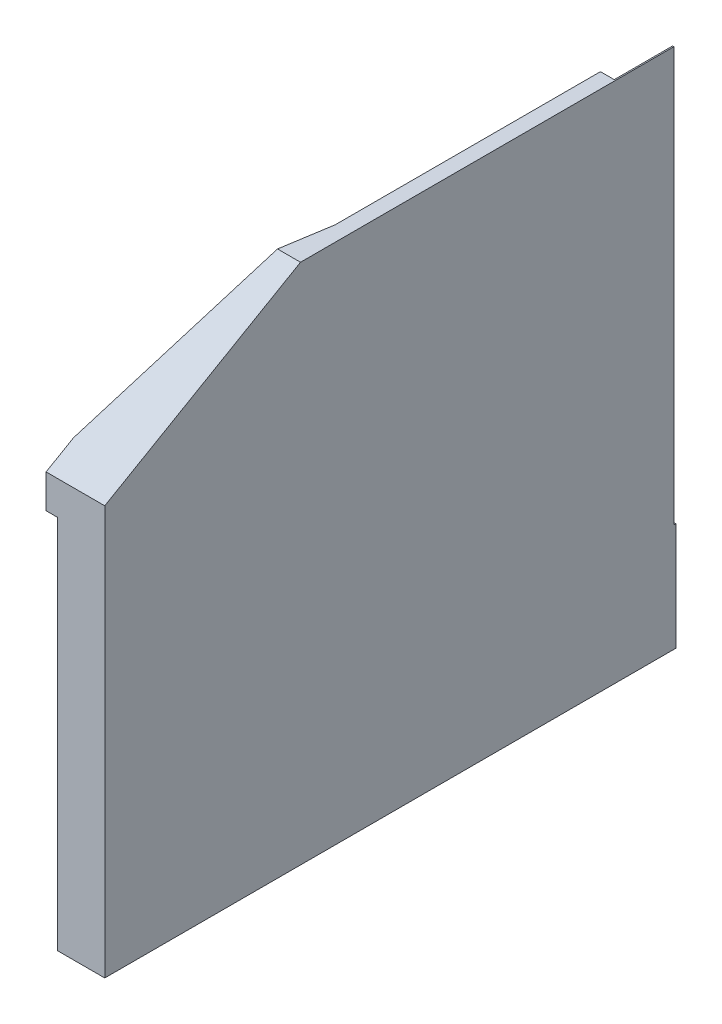
ISO-10303-21;
HEADER;
FILE_DESCRIPTION(('STEP AP214'),'2;1');
FILE_NAME('part.step','',(''),(''),'','','');
FILE_SCHEMA(('AUTOMOTIVE_DESIGN { 1 0 10303 214 1 1 1 1 }'));
ENDSEC;
DATA;
#1=APPLICATION_CONTEXT('core data for automotive mechanical design processes');
#2=APPLICATION_PROTOCOL_DEFINITION('international standard','automotive_design',2000,#1);
#3=PRODUCT_CONTEXT('',#1,'mechanical');
#4=PRODUCT('Part','Part','',(#3));
#5=PRODUCT_RELATED_PRODUCT_CATEGORY('part','',(#4));
#6=PRODUCT_DEFINITION_FORMATION('','',#4);
#7=PRODUCT_DEFINITION_CONTEXT('part definition',#1,'design');
#8=PRODUCT_DEFINITION('design','',#6,#7);
#9=PRODUCT_DEFINITION_SHAPE('','',#8);
#10=(LENGTH_UNIT() NAMED_UNIT(*) SI_UNIT(.MILLI.,.METRE.));
#11=(NAMED_UNIT(*) PLANE_ANGLE_UNIT() SI_UNIT($,.RADIAN.));
#12=(NAMED_UNIT(*) SI_UNIT($,.STERADIAN.) SOLID_ANGLE_UNIT());
#13=UNCERTAINTY_MEASURE_WITH_UNIT(LENGTH_MEASURE(1.E-05),#10,'distance_accuracy_value','');
#14=(GEOMETRIC_REPRESENTATION_CONTEXT(3) GLOBAL_UNCERTAINTY_ASSIGNED_CONTEXT((#13)) GLOBAL_UNIT_ASSIGNED_CONTEXT((#10,
#11,#12)) REPRESENTATION_CONTEXT('',''));
#15=CARTESIAN_POINT('',(0.,0.,0.));
#16=DIRECTION('',(0.,0.,1.));
#17=DIRECTION('',(1.,0.,0.));
#18=AXIS2_PLACEMENT_3D('',#15,#16,#17);
#19=CARTESIAN_POINT('',(145.5,-389.,1434.5));
#20=DIRECTION('',(1.,0.,0.));
#21=DIRECTION('',(0.,0.,1.));
#22=AXIS2_PLACEMENT_3D('',#19,#20,#21);
#23=PLANE('',#22);
#24=DIRECTION('',(0.,0.,1.));
#25=VECTOR('',#24,1.);
#26=CARTESIAN_POINT('',(145.5,216.,1437.));
#27=LINE('',#26,#25);
#28=CARTESIAN_POINT('',(145.5,216.,1437.));
#29=VERTEX_POINT('',#28);
#30=CARTESIAN_POINT('',(145.5,216.,1869.6013442085));
#31=VERTEX_POINT('',#30);
#32=EDGE_CURVE('E11',#29,#31,#27,.T.);
#33=ORIENTED_EDGE('',*,*,#32,.T.);
#34=DIRECTION('',(0.,0.500000000000017,-0.866025403784429));
#35=VECTOR('',#34,1.);
#36=CARTESIAN_POINT('',(145.5,85.,2096.5));
#37=LINE('',#36,#35);
#38=CARTESIAN_POINT('',(145.5,85.,2096.5));
#39=VERTEX_POINT('',#38);
#40=EDGE_CURVE('E36',#39,#31,#37,.T.);
#41=ORIENTED_EDGE('',*,*,#40,.F.);
#42=DIRECTION('',(0.,-1.,0.));
#43=VECTOR('',#42,1.);
#44=CARTESIAN_POINT('',(145.5,85.,2096.5));
#45=LINE('',#44,#43);
#46=CARTESIAN_POINT('',(145.5,-389.,2096.5));
#47=VERTEX_POINT('',#46);
#48=EDGE_CURVE('E27',#39,#47,#45,.T.);
#49=ORIENTED_EDGE('',*,*,#48,.T.);
#50=DIRECTION('',(0.,0.,-1.));
#51=VECTOR('',#50,1.);
#52=CARTESIAN_POINT('',(145.5,-389.,2096.5));
#53=LINE('',#52,#51);
#54=CARTESIAN_POINT('',(145.5,-389.,1434.5));
#55=VERTEX_POINT('',#54);
#56=EDGE_CURVE('E269',#47,#55,#53,.T.);
#57=ORIENTED_EDGE('',*,*,#56,.T.);
#58=DIRECTION('',(0.,1.,0.));
#59=VECTOR('',#58,1.);
#60=CARTESIAN_POINT('',(145.5,-389.,1434.5));
#61=LINE('',#60,#59);
#62=CARTESIAN_POINT('',(145.5,-264.,1434.5));
#63=VERTEX_POINT('',#62);
#64=EDGE_CURVE('E212',#55,#63,#61,.T.);
#65=ORIENTED_EDGE('',*,*,#64,.T.);
#66=DIRECTION('',(0.,0.,1.));
#67=VECTOR('',#66,1.);
#68=CARTESIAN_POINT('',(145.5,-264.,1434.5));
#69=LINE('',#68,#67);
#70=CARTESIAN_POINT('',(145.5,-264.,1437.));
#71=VERTEX_POINT('',#70);
#72=EDGE_CURVE('E209',#63,#71,#69,.T.);
#73=ORIENTED_EDGE('',*,*,#72,.T.);
#74=DIRECTION('',(0.,-1.,0.));
#75=VECTOR('',#74,1.);
#76=CARTESIAN_POINT('',(145.5,216.,1437.));
#77=LINE('',#76,#75);
#78=EDGE_CURVE('E250',#29,#71,#77,.T.);
#79=ORIENTED_EDGE('',*,*,#78,.F.);
#80=EDGE_LOOP('',(#33,#41,#49,#57,#65,#73,#79));
#81=FACE_BOUND('',#80,.T.);
#82=ADVANCED_FACE('F17',(#81),#23,.T.);
#83=CARTESIAN_POINT('',(145.5,-389.,1437.));
#84=DIRECTION('',(0.,0.,1.));
#85=DIRECTION('',(1.,0.,0.));
#86=AXIS2_PLACEMENT_3D('',#83,#84,#85);
#87=PLANE('',#86);
#88=DIRECTION('',(1.,0.,0.));
#89=VECTOR('',#88,1.);
#90=CARTESIAN_POINT('',(144.,216.,1437.));
#91=LINE('',#90,#89);
#92=CARTESIAN_POINT('',(144.,216.,1437.));
#93=VERTEX_POINT('',#92);
#94=EDGE_CURVE('E213',#93,#29,#91,.T.);
#95=ORIENTED_EDGE('',*,*,#94,.T.);
#96=ORIENTED_EDGE('',*,*,#78,.T.);
#97=DIRECTION('',(1.,0.,0.));
#98=VECTOR('',#97,1.);
#99=CARTESIAN_POINT('',(144.,-264.,1437.));
#100=LINE('',#99,#98);
#101=CARTESIAN_POINT('',(144.,-264.,1437.));
#102=VERTEX_POINT('',#101);
#103=EDGE_CURVE('E224',#102,#71,#100,.T.);
#104=ORIENTED_EDGE('',*,*,#103,.F.);
#105=DIRECTION('',(0.,1.,0.));
#106=VECTOR('',#105,1.);
#107=CARTESIAN_POINT('',(144.,-264.,1437.));
#108=LINE('',#107,#106);
#109=EDGE_CURVE('E253',#102,#93,#108,.T.);
#110=ORIENTED_EDGE('',*,*,#109,.T.);
#111=EDGE_LOOP('',(#95,#96,#104,#110));
#112=FACE_BOUND('',#111,.T.);
#113=ADVANCED_FACE('F424',(#112),#87,.F.);
#114=CARTESIAN_POINT('',(144.,216.,1504.5));
#115=DIRECTION('',(1.,0.,0.));
#116=DIRECTION('',(0.,0.,1.));
#117=AXIS2_PLACEMENT_3D('',#114,#115,#116);
#118=PLANE('',#117);
#119=DIRECTION('',(0.,0.,1.));
#120=VECTOR('',#119,1.);
#121=CARTESIAN_POINT('',(144.,216.,1437.));
#122=LINE('',#121,#120);
#123=CARTESIAN_POINT('',(144.,216.,1504.5));
#124=VERTEX_POINT('',#123);
#125=EDGE_CURVE('E208',#93,#124,#122,.T.);
#126=ORIENTED_EDGE('',*,*,#125,.F.);
#127=ORIENTED_EDGE('',*,*,#109,.F.);
#128=DIRECTION('',(0.,0.,-1.));
#129=VECTOR('',#128,1.);
#130=CARTESIAN_POINT('',(144.,-264.,1437.));
#131=LINE('',#130,#129);
#132=CARTESIAN_POINT('',(144.,-264.,1436.));
#133=VERTEX_POINT('',#132);
#134=EDGE_CURVE('E218',#102,#133,#131,.T.);
#135=ORIENTED_EDGE('',*,*,#134,.T.);
#136=DIRECTION('',(0.,1.,0.));
#137=VECTOR('',#136,1.);
#138=CARTESIAN_POINT('',(144.,-387.5,1436.));
#139=LINE('',#138,#137);
#140=CARTESIAN_POINT('',(144.,-387.5,1436.));
#141=VERTEX_POINT('',#140);
#142=EDGE_CURVE('E163',#141,#133,#139,.T.);
#143=ORIENTED_EDGE('',*,*,#142,.F.);
#144=DIRECTION('',(0.,0.,-1.));
#145=VECTOR('',#144,1.);
#146=CARTESIAN_POINT('',(144.,-387.5,2095.));
#147=LINE('',#146,#145);
#148=CARTESIAN_POINT('',(144.,-387.5,2095.));
#149=VERTEX_POINT('',#148);
#150=EDGE_CURVE('E154',#149,#141,#147,.T.);
#151=ORIENTED_EDGE('',*,*,#150,.F.);
#152=DIRECTION('',(0.,-1.,0.));
#153=VECTOR('',#152,1.);
#154=CARTESIAN_POINT('',(144.,84.1339745962001,2095.));
#155=LINE('',#154,#153);
#156=CARTESIAN_POINT('',(144.,84.1339745962001,2095.));
#157=VERTEX_POINT('',#156);
#158=EDGE_CURVE('E159',#157,#149,#155,.T.);
#159=ORIENTED_EDGE('',*,*,#158,.F.);
#160=DIRECTION('',(0.,0.500000000000017,-0.866025403784429));
#161=VECTOR('',#160,1.);
#162=CARTESIAN_POINT('',(144.,84.1339745962001,2095.));
#163=LINE('',#162,#161);
#164=CARTESIAN_POINT('',(144.,214.5,1869.1994204198));
#165=VERTEX_POINT('',#164);
#166=EDGE_CURVE('E216',#157,#165,#163,.T.);
#167=ORIENTED_EDGE('',*,*,#166,.T.);
#168=DIRECTION('',(0.,0.,1.));
#169=VECTOR('',#168,1.);
#170=CARTESIAN_POINT('',(144.,214.5,1504.5));
#171=LINE('',#170,#169);
#172=CARTESIAN_POINT('',(144.,214.5,1504.5));
#173=VERTEX_POINT('',#172);
#174=EDGE_CURVE('E273',#173,#165,#171,.T.);
#175=ORIENTED_EDGE('',*,*,#174,.F.);
#176=DIRECTION('',(0.,-1.,0.));
#177=VECTOR('',#176,1.);
#178=CARTESIAN_POINT('',(144.,216.,1504.5));
#179=LINE('',#178,#177);
#180=EDGE_CURVE('E231',#124,#173,#179,.T.);
#181=ORIENTED_EDGE('',*,*,#180,.F.);
#182=EDGE_LOOP('',(#126,#127,#135,#143,#151,#159,#167,#175,#181));
#183=FACE_BOUND('',#182,.T.);
#184=ADVANCED_FACE('F157',(#183),#118,.F.);
#185=CARTESIAN_POINT('',(64.,216.,1504.5));
#186=DIRECTION('',(0.,0.,1.));
#187=DIRECTION('',(1.,0.,0.));
#188=AXIS2_PLACEMENT_3D('',#185,#186,#187);
#189=PLANE('',#188);
#190=DIRECTION('',(1.,0.,0.));
#191=VECTOR('',#190,1.);
#192=CARTESIAN_POINT('',(128.,216.,1504.5));
#193=LINE('',#192,#191);
#194=CARTESIAN_POINT('',(128.,216.,1504.5));
#195=VERTEX_POINT('',#194);
#196=EDGE_CURVE('E219',#195,#124,#193,.T.);
#197=ORIENTED_EDGE('',*,*,#196,.T.);
#198=ORIENTED_EDGE('',*,*,#180,.T.);
#199=DIRECTION('',(1.,0.,0.));
#200=VECTOR('',#199,1.);
#201=CARTESIAN_POINT('',(128.,214.5,1504.5));
#202=LINE('',#201,#200);
#203=CARTESIAN_POINT('',(128.,214.5,1504.5));
#204=VERTEX_POINT('',#203);
#205=EDGE_CURVE('E270',#204,#173,#202,.T.);
#206=ORIENTED_EDGE('',*,*,#205,.F.);
#207=DIRECTION('',(0.,1.,0.));
#208=VECTOR('',#207,1.);
#209=CARTESIAN_POINT('',(128.,214.5,1504.5));
#210=LINE('',#209,#208);
#211=EDGE_CURVE('E203',#204,#195,#210,.T.);
#212=ORIENTED_EDGE('',*,*,#211,.T.);
#213=EDGE_LOOP('',(#197,#198,#206,#212));
#214=FACE_BOUND('',#213,.T.);
#215=ADVANCED_FACE('F307',(#214),#189,.F.);
#216=CARTESIAN_POINT('',(128.,240.9814304865,1826.3322373602));
#217=DIRECTION('',(1.,0.,0.));
#218=DIRECTION('',(0.,0.,1.));
#219=AXIS2_PLACEMENT_3D('',#216,#217,#218);
#220=PLANE('',#219);
#221=ORIENTED_EDGE('',*,*,#211,.F.);
#222=DIRECTION('',(0.,0.,1.));
#223=VECTOR('',#222,1.);
#224=CARTESIAN_POINT('',(128.,214.5,1504.5));
#225=LINE('',#224,#223);
#226=CARTESIAN_POINT('',(128.,214.5,1811.0431763403));
#227=VERTEX_POINT('',#226);
#228=EDGE_CURVE('E201',#204,#227,#225,.T.);
#229=ORIENTED_EDGE('',*,*,#228,.T.);
#230=DIRECTION('',(0.,-0.866025403784429,-0.500000000000017));
#231=VECTOR('',#230,1.);
#232=CARTESIAN_POINT('',(128.,216.,1811.9092017441));
#233=LINE('',#232,#231);
#234=CARTESIAN_POINT('',(128.,216.,1811.9092017441));
#235=VERTEX_POINT('',#234);
#236=EDGE_CURVE('E220',#235,#227,#233,.T.);
#237=ORIENTED_EDGE('',*,*,#236,.F.);
#238=DIRECTION('',(0.,0.,1.));
#239=VECTOR('',#238,1.);
#240=CARTESIAN_POINT('',(128.,216.,1504.5));
#241=LINE('',#240,#239);
#242=EDGE_CURVE('E256',#195,#235,#241,.T.);
#243=ORIENTED_EDGE('',*,*,#242,.F.);
#244=EDGE_LOOP('',(#221,#229,#237,#243));
#245=FACE_BOUND('',#244,.T.);
#246=ADVANCED_FACE('F316',(#245),#220,.F.);
#247=CARTESIAN_POINT('',(145.5,216.,1434.5));
#248=DIRECTION('',(0.,1.,0.));
#249=DIRECTION('',(0.,0.,-1.));
#250=AXIS2_PLACEMENT_3D('',#247,#248,#249);
#251=PLANE('',#250);
#252=DIRECTION('',(1.,0.,0.));
#253=VECTOR('',#252,1.);
#254=CARTESIAN_POINT('',(118.83009905763,216.,1869.6013442085));
#255=LINE('',#254,#253);
#256=CARTESIAN_POINT('',(118.83009905763,216.,1869.6013442085));
#257=VERTEX_POINT('',#256);
#258=EDGE_CURVE('E204',#257,#31,#255,.T.);
#259=ORIENTED_EDGE('',*,*,#258,.T.);
#260=ORIENTED_EDGE('',*,*,#32,.F.);
#261=ORIENTED_EDGE('',*,*,#94,.F.);
#262=ORIENTED_EDGE('',*,*,#125,.T.);
#263=ORIENTED_EDGE('',*,*,#196,.F.);
#264=ORIENTED_EDGE('',*,*,#242,.T.);
#265=DIRECTION('',(0.156974894079197,0.,-0.987602593470078));
#266=VECTOR('',#265,1.);
#267=CARTESIAN_POINT('',(118.83009905763,216.,1869.6013442085));
#268=LINE('',#267,#266);
#269=EDGE_CURVE('E222',#257,#235,#268,.T.);
#270=ORIENTED_EDGE('',*,*,#269,.F.);
#271=EDGE_LOOP('',(#259,#260,#261,#262,#263,#264,#270));
#272=FACE_BOUND('',#271,.T.);
#273=ADVANCED_FACE('F320',(#272),#251,.T.);
#274=CARTESIAN_POINT('',(77.5,103.405,2064.6216048867));
#275=DIRECTION('',(0.983571470813392,-0.0902595726252793,0.156334165656399));
#276=DIRECTION('',(0.,0.866025403784386,0.500000000000091));
#277=AXIS2_PLACEMENT_3D('',#274,#275,#276);
#278=PLANE('',#277);
#279=DIRECTION('',(-0.180519145250601,-0.491785735406702,0.851797880162003));
#280=VECTOR('',#279,1.);
#281=CARTESIAN_POINT('',(118.83009905763,216.,1869.6013442085));
#282=LINE('',#281,#280);
#283=CARTESIAN_POINT('',(77.5,103.405,2064.6216048867));
#284=VERTEX_POINT('',#283);
#285=EDGE_CURVE('E215',#257,#284,#282,.T.);
#286=ORIENTED_EDGE('',*,*,#285,.F.);
#287=ORIENTED_EDGE('',*,*,#269,.T.);
#288=ORIENTED_EDGE('',*,*,#236,.T.);
#289=DIRECTION('',(0.156974894079197,0.,-0.987602593470079));
#290=VECTOR('',#289,1.);
#291=CARTESIAN_POINT('',(118.7563322385,214.5,1869.1994204198));
#292=LINE('',#291,#290);
#293=CARTESIAN_POINT('',(118.7563322385,214.5,1869.1994204198));
#294=VERTEX_POINT('',#293);
#295=EDGE_CURVE('E244',#294,#227,#292,.T.);
#296=ORIENTED_EDGE('',*,*,#295,.F.);
#297=DIRECTION('',(-0.180519145250601,-0.491785735406702,0.851797880162003));
#298=VECTOR('',#297,1.);
#299=CARTESIAN_POINT('',(118.7563322385,214.5,1869.1994204198));
#300=LINE('',#299,#298);
#301=CARTESIAN_POINT('',(77.5,102.1059618943,2063.8716048867));
#302=VERTEX_POINT('',#301);
#303=EDGE_CURVE('E223',#294,#302,#300,.T.);
#304=ORIENTED_EDGE('',*,*,#303,.T.);
#305=DIRECTION('',(0.,0.866025403784497,0.499999999999898));
#306=VECTOR('',#305,1.);
#307=CARTESIAN_POINT('',(77.5,102.1059618943,2063.8716048867));
#308=LINE('',#307,#306);
#309=EDGE_CURVE('E264',#302,#284,#308,.T.);
#310=ORIENTED_EDGE('',*,*,#309,.T.);
#311=EDGE_LOOP('',(#286,#287,#288,#296,#304,#310));
#312=FACE_BOUND('',#311,.T.);
#313=ADVANCED_FACE('F397',(#312),#278,.F.);
#314=CARTESIAN_POINT('',(77.5,-389.,1434.5));
#315=DIRECTION('',(1.,0.,0.));
#316=DIRECTION('',(0.,0.,1.));
#317=AXIS2_PLACEMENT_3D('',#314,#315,#316);
#318=PLANE('',#317);
#319=DIRECTION('',(0.,0.500000000000017,-0.866025403784429));
#320=VECTOR('',#319,1.);
#321=CARTESIAN_POINT('',(77.5,84.1339745962001,2095.));
#322=LINE('',#321,#320);
#323=CARTESIAN_POINT('',(77.5,84.1339745962001,2095.));
#324=VERTEX_POINT('',#323);
#325=EDGE_CURVE('E240',#324,#302,#322,.T.);
#326=ORIENTED_EDGE('',*,*,#325,.F.);
#327=DIRECTION('',(0.,1.,0.));
#328=VECTOR('',#327,1.);
#329=CARTESIAN_POINT('',(77.5,46.,2095.));
#330=LINE('',#329,#328);
#331=CARTESIAN_POINT('',(77.5,46.,2095.));
#332=VERTEX_POINT('',#331);
#333=EDGE_CURVE('E266',#332,#324,#330,.T.);
#334=ORIENTED_EDGE('',*,*,#333,.F.);
#335=DIRECTION('',(0.,0.,1.));
#336=VECTOR('',#335,1.);
#337=CARTESIAN_POINT('',(77.5,46.,2095.));
#338=LINE('',#337,#336);
#339=CARTESIAN_POINT('',(77.5,46.,2096.5));
#340=VERTEX_POINT('',#339);
#341=EDGE_CURVE('E287',#332,#340,#338,.T.);
#342=ORIENTED_EDGE('',*,*,#341,.T.);
#343=DIRECTION('',(0.,-1.,0.));
#344=VECTOR('',#343,1.);
#345=CARTESIAN_POINT('',(77.5,85.,2096.5));
#346=LINE('',#345,#344);
#347=CARTESIAN_POINT('',(77.5,85.,2096.5));
#348=VERTEX_POINT('',#347);
#349=EDGE_CURVE('E122',#348,#340,#346,.T.);
#350=ORIENTED_EDGE('',*,*,#349,.F.);
#351=DIRECTION('',(0.,0.500000000000017,-0.866025403784429));
#352=VECTOR('',#351,1.);
#353=CARTESIAN_POINT('',(77.5,85.,2096.5));
#354=LINE('',#353,#352);
#355=EDGE_CURVE('E195',#348,#284,#354,.T.);
#356=ORIENTED_EDGE('',*,*,#355,.T.);
#357=ORIENTED_EDGE('',*,*,#309,.F.);
#358=EDGE_LOOP('',(#326,#334,#342,#350,#356,#357));
#359=FACE_BOUND('',#358,.T.);
#360=ADVANCED_FACE('F389',(#359),#318,.F.);
#361=CARTESIAN_POINT('',(145.5,85.,2096.5));
#362=DIRECTION('',(0.,-0.866025403784429,-0.500000000000017));
#363=DIRECTION('',(-1.,0.,0.));
#364=AXIS2_PLACEMENT_3D('',#361,#362,#363);
#365=PLANE('',#364);
#366=ORIENTED_EDGE('',*,*,#355,.F.);
#367=DIRECTION('',(1.,0.,0.));
#368=VECTOR('',#367,1.);
#369=CARTESIAN_POINT('',(77.5,85.,2096.5));
#370=LINE('',#369,#368);
#371=EDGE_CURVE('E193',#348,#39,#370,.T.);
#372=ORIENTED_EDGE('',*,*,#371,.T.);
#373=ORIENTED_EDGE('',*,*,#40,.T.);
#374=ORIENTED_EDGE('',*,*,#258,.F.);
#375=ORIENTED_EDGE('',*,*,#285,.T.);
#376=EDGE_LOOP('',(#366,#372,#373,#374,#375));
#377=FACE_BOUND('',#376,.T.);
#378=ADVANCED_FACE('F400',(#377),#365,.F.);
#379=CARTESIAN_POINT('',(145.5,216.,2096.5));
#380=DIRECTION('',(0.,0.,1.));
#381=DIRECTION('',(1.,0.,0.));
#382=AXIS2_PLACEMENT_3D('',#379,#380,#381);
#383=PLANE('',#382);
#384=DIRECTION('',(-1.,0.,0.));
#385=VECTOR('',#384,1.);
#386=CARTESIAN_POINT('',(145.5,-389.,2096.5));
#387=LINE('',#386,#385);
#388=CARTESIAN_POINT('',(90.5,-389.,2096.5));
#389=VERTEX_POINT('',#388);
#390=EDGE_CURVE('E236',#47,#389,#387,.T.);
#391=ORIENTED_EDGE('',*,*,#390,.F.);
#392=ORIENTED_EDGE('',*,*,#48,.F.);
#393=ORIENTED_EDGE('',*,*,#371,.F.);
#394=ORIENTED_EDGE('',*,*,#349,.T.);
#395=DIRECTION('',(1.,0.,0.));
#396=VECTOR('',#395,1.);
#397=CARTESIAN_POINT('',(77.5,46.,2096.5));
#398=LINE('',#397,#396);
#399=CARTESIAN_POINT('',(90.5,46.,2096.5));
#400=VERTEX_POINT('',#399);
#401=EDGE_CURVE('E280',#340,#400,#398,.T.);
#402=ORIENTED_EDGE('',*,*,#401,.T.);
#403=DIRECTION('',(0.,1.,0.));
#404=VECTOR('',#403,1.);
#405=CARTESIAN_POINT('',(90.5,-389.,2096.5));
#406=LINE('',#405,#404);
#407=EDGE_CURVE('E248',#389,#400,#406,.T.);
#408=ORIENTED_EDGE('',*,*,#407,.F.);
#409=EDGE_LOOP('',(#391,#392,#393,#394,#402,#408));
#410=FACE_BOUND('',#409,.T.);
#411=ADVANCED_FACE('F381',(#410),#383,.T.);
#412=CARTESIAN_POINT('',(90.5,-389.,1434.5));
#413=DIRECTION('',(1.,0.,0.));
#414=DIRECTION('',(0.,0.,1.));
#415=AXIS2_PLACEMENT_3D('',#412,#413,#414);
#416=PLANE('',#415);
#417=DIRECTION('',(0.,0.,1.));
#418=VECTOR('',#417,1.);
#419=CARTESIAN_POINT('',(90.5,-379.,1436.));
#420=LINE('',#419,#418);
#421=CARTESIAN_POINT('',(90.5,-379.,1436.));
#422=VERTEX_POINT('',#421);
#423=CARTESIAN_POINT('',(90.5,-379.,2095.));
#424=VERTEX_POINT('',#423);
#425=EDGE_CURVE('E187',#422,#424,#420,.T.);
#426=ORIENTED_EDGE('',*,*,#425,.F.);
#427=DIRECTION('',(0.,-1.,0.));
#428=VECTOR('',#427,1.);
#429=CARTESIAN_POINT('',(90.5,-294.,1436.));
#430=LINE('',#429,#428);
#431=CARTESIAN_POINT('',(90.5,-294.,1436.));
#432=VERTEX_POINT('',#431);
#433=EDGE_CURVE('E258',#432,#422,#430,.T.);
#434=ORIENTED_EDGE('',*,*,#433,.F.);
#435=DIRECTION('',(0.,0.,1.));
#436=VECTOR('',#435,1.);
#437=CARTESIAN_POINT('',(90.5,-294.,1434.5));
#438=LINE('',#437,#436);
#439=CARTESIAN_POINT('',(90.5,-294.,1434.5));
#440=VERTEX_POINT('',#439);
#441=EDGE_CURVE('E239',#440,#432,#438,.T.);
#442=ORIENTED_EDGE('',*,*,#441,.F.);
#443=DIRECTION('',(0.,1.,0.));
#444=VECTOR('',#443,1.);
#445=CARTESIAN_POINT('',(90.5,-389.,1434.5));
#446=LINE('',#445,#444);
#447=CARTESIAN_POINT('',(90.5,-389.,1434.5));
#448=VERTEX_POINT('',#447);
#449=EDGE_CURVE('E196',#448,#440,#446,.T.);
#450=ORIENTED_EDGE('',*,*,#449,.F.);
#451=DIRECTION('',(0.,0.,-1.));
#452=VECTOR('',#451,1.);
#453=CARTESIAN_POINT('',(90.5,-389.,2096.5));
#454=LINE('',#453,#452);
#455=EDGE_CURVE('E226',#389,#448,#454,.T.);
#456=ORIENTED_EDGE('',*,*,#455,.F.);
#457=ORIENTED_EDGE('',*,*,#407,.T.);
#458=DIRECTION('',(0.,0.,1.));
#459=VECTOR('',#458,1.);
#460=CARTESIAN_POINT('',(90.5,46.,2095.));
#461=LINE('',#460,#459);
#462=CARTESIAN_POINT('',(90.5,46.,2095.));
#463=VERTEX_POINT('',#462);
#464=EDGE_CURVE('E191',#463,#400,#461,.T.);
#465=ORIENTED_EDGE('',*,*,#464,.F.);
#466=DIRECTION('',(0.,-1.,0.));
#467=VECTOR('',#466,1.);
#468=CARTESIAN_POINT('',(90.5,46.,2095.));
#469=LINE('',#468,#467);
#470=EDGE_CURVE('E245',#463,#424,#469,.T.);
#471=ORIENTED_EDGE('',*,*,#470,.T.);
#472=EDGE_LOOP('',(#426,#434,#442,#450,#456,#457,#465,#471));
#473=FACE_BOUND('',#472,.T.);
#474=ADVANCED_FACE('F356',(#473),#416,.F.);
#475=CARTESIAN_POINT('',(90.5,-379.,2095.));
#476=DIRECTION('',(0.,0.,1.));
#477=DIRECTION('',(1.,0.,0.));
#478=AXIS2_PLACEMENT_3D('',#475,#476,#477);
#479=PLANE('',#478);
#480=ORIENTED_EDGE('',*,*,#470,.F.);
#481=DIRECTION('',(-1.,0.,0.));
#482=VECTOR('',#481,1.);
#483=CARTESIAN_POINT('',(90.5,46.,2095.));
#484=LINE('',#483,#482);
#485=EDGE_CURVE('E249',#463,#332,#484,.T.);
#486=ORIENTED_EDGE('',*,*,#485,.T.);
#487=ORIENTED_EDGE('',*,*,#333,.T.);
#488=DIRECTION('',(1.,0.,0.));
#489=VECTOR('',#488,1.);
#490=CARTESIAN_POINT('',(77.5,84.1339745962001,2095.));
#491=LINE('',#490,#489);
#492=EDGE_CURVE('E180',#324,#157,#491,.T.);
#493=ORIENTED_EDGE('',*,*,#492,.T.);
#494=ORIENTED_EDGE('',*,*,#158,.T.);
#495=DIRECTION('',(-1.,0.,0.));
#496=VECTOR('',#495,1.);
#497=CARTESIAN_POINT('',(144.,-387.5,2095.));
#498=LINE('',#497,#496);
#499=CARTESIAN_POINT('',(92.,-387.5,2095.));
#500=VERTEX_POINT('',#499);
#501=EDGE_CURVE('E176',#149,#500,#498,.T.);
#502=ORIENTED_EDGE('',*,*,#501,.T.);
#503=DIRECTION('',(0.,1.,0.));
#504=VECTOR('',#503,1.);
#505=CARTESIAN_POINT('',(92.,-387.5,2095.));
#506=LINE('',#505,#504);
#507=CARTESIAN_POINT('',(92.,-379.,2095.));
#508=VERTEX_POINT('',#507);
#509=EDGE_CURVE('E185',#500,#508,#506,.T.);
#510=ORIENTED_EDGE('',*,*,#509,.T.);
#511=DIRECTION('',(1.,0.,0.));
#512=VECTOR('',#511,1.);
#513=CARTESIAN_POINT('',(90.5,-379.,2095.));
#514=LINE('',#513,#512);
#515=EDGE_CURVE('E232',#424,#508,#514,.T.);
#516=ORIENTED_EDGE('',*,*,#515,.F.);
#517=EDGE_LOOP('',(#480,#486,#487,#493,#494,#502,#510,#516));
#518=FACE_BOUND('',#517,.T.);
#519=ADVANCED_FACE('F174',(#518),#479,.F.);
#520=CARTESIAN_POINT('',(90.5,-379.,1436.));
#521=DIRECTION('',(0.,-1.,0.));
#522=DIRECTION('',(1.,0.,0.));
#523=AXIS2_PLACEMENT_3D('',#520,#521,#522);
#524=PLANE('',#523);
#525=DIRECTION('',(1.,0.,0.));
#526=VECTOR('',#525,1.);
#527=CARTESIAN_POINT('',(90.5,-379.,1436.));
#528=LINE('',#527,#526);
#529=CARTESIAN_POINT('',(92.,-379.,1436.));
#530=VERTEX_POINT('',#529);
#531=EDGE_CURVE('E238',#422,#530,#528,.T.);
#532=ORIENTED_EDGE('',*,*,#531,.F.);
#533=ORIENTED_EDGE('',*,*,#425,.T.);
#534=ORIENTED_EDGE('',*,*,#515,.T.);
#535=DIRECTION('',(0.,0.,1.));
#536=VECTOR('',#535,1.);
#537=CARTESIAN_POINT('',(92.,-379.,1436.));
#538=LINE('',#537,#536);
#539=EDGE_CURVE('E261',#530,#508,#538,.T.);
#540=ORIENTED_EDGE('',*,*,#539,.F.);
#541=EDGE_LOOP('',(#532,#533,#534,#540));
#542=FACE_BOUND('',#541,.T.);
#543=ADVANCED_FACE('F411',(#542),#524,.F.);
#544=CARTESIAN_POINT('',(92.,-389.,1434.5));
#545=DIRECTION('',(-1.,0.,0.));
#546=DIRECTION('',(0.,-1.,0.));
#547=AXIS2_PLACEMENT_3D('',#544,#545,#546);
#548=PLANE('',#547);
#549=DIRECTION('',(0.,0.,-1.));
#550=VECTOR('',#549,1.);
#551=CARTESIAN_POINT('',(92.,-387.5,2095.));
#552=LINE('',#551,#550);
#553=CARTESIAN_POINT('',(92.,-387.5,1436.));
#554=VERTEX_POINT('',#553);
#555=EDGE_CURVE('E184',#500,#554,#552,.T.);
#556=ORIENTED_EDGE('',*,*,#555,.T.);
#557=DIRECTION('',(0.,1.,0.));
#558=VECTOR('',#557,1.);
#559=CARTESIAN_POINT('',(92.,-387.5,1436.));
#560=LINE('',#559,#558);
#561=EDGE_CURVE('E281',#554,#530,#560,.T.);
#562=ORIENTED_EDGE('',*,*,#561,.T.);
#563=ORIENTED_EDGE('',*,*,#539,.T.);
#564=ORIENTED_EDGE('',*,*,#509,.F.);
#565=EDGE_LOOP('',(#556,#562,#563,#564));
#566=FACE_BOUND('',#565,.T.);
#567=ADVANCED_FACE('F407',(#566),#548,.F.);
#568=CARTESIAN_POINT('',(90.5,46.,1436.));
#569=DIRECTION('',(0.,0.,-1.));
#570=DIRECTION('',(0.,1.,0.));
#571=AXIS2_PLACEMENT_3D('',#568,#569,#570);
#572=PLANE('',#571);
#573=ORIENTED_EDGE('',*,*,#433,.T.);
#574=ORIENTED_EDGE('',*,*,#531,.T.);
#575=ORIENTED_EDGE('',*,*,#561,.F.);
#576=DIRECTION('',(-1.,0.,0.));
#577=VECTOR('',#576,1.);
#578=CARTESIAN_POINT('',(144.,-387.5,1436.));
#579=LINE('',#578,#577);
#580=EDGE_CURVE('E21',#141,#554,#579,.T.);
#581=ORIENTED_EDGE('',*,*,#580,.F.);
#582=ORIENTED_EDGE('',*,*,#142,.T.);
#583=DIRECTION('',(1.,0.,0.));
#584=VECTOR('',#583,1.);
#585=CARTESIAN_POINT('',(96.5,-264.,1436.));
#586=LINE('',#585,#584);
#587=CARTESIAN_POINT('',(96.5,-264.,1436.));
#588=VERTEX_POINT('',#587);
#589=EDGE_CURVE('E293',#588,#133,#586,.T.);
#590=ORIENTED_EDGE('',*,*,#589,.F.);
#591=DIRECTION('',(0.,1.,0.));
#592=VECTOR('',#591,1.);
#593=CARTESIAN_POINT('',(96.5,-294.,1436.));
#594=LINE('',#593,#592);
#595=CARTESIAN_POINT('',(96.5,-294.,1436.));
#596=VERTEX_POINT('',#595);
#597=EDGE_CURVE('E168',#596,#588,#594,.T.);
#598=ORIENTED_EDGE('',*,*,#597,.F.);
#599=DIRECTION('',(1.,0.,0.));
#600=VECTOR('',#599,1.);
#601=CARTESIAN_POINT('',(90.5,-294.,1436.));
#602=LINE('',#601,#600);
#603=EDGE_CURVE('E297',#432,#596,#602,.T.);
#604=ORIENTED_EDGE('',*,*,#603,.F.);
#605=EDGE_LOOP('',(#573,#574,#575,#581,#582,#590,#598,#604));
#606=FACE_BOUND('',#605,.T.);
#607=ADVANCED_FACE('F334',(#606),#572,.F.);
#608=CARTESIAN_POINT('',(25.5,-294.,1434.5));
#609=DIRECTION('',(0.,-1.,0.));
#610=DIRECTION('',(1.,0.,0.));
#611=AXIS2_PLACEMENT_3D('',#608,#609,#610);
#612=PLANE('',#611);
#613=DIRECTION('',(0.,0.,1.));
#614=VECTOR('',#613,1.);
#615=CARTESIAN_POINT('',(96.5,-294.,1434.5));
#616=LINE('',#615,#614);
#617=CARTESIAN_POINT('',(96.5,-294.,1434.5));
#618=VERTEX_POINT('',#617);
#619=EDGE_CURVE('E296',#618,#596,#616,.T.);
#620=ORIENTED_EDGE('',*,*,#619,.F.);
#621=DIRECTION('',(1.,0.,0.));
#622=VECTOR('',#621,1.);
#623=CARTESIAN_POINT('',(90.5,-294.,1434.5));
#624=LINE('',#623,#622);
#625=EDGE_CURVE('E200',#440,#618,#624,.T.);
#626=ORIENTED_EDGE('',*,*,#625,.F.);
#627=ORIENTED_EDGE('',*,*,#441,.T.);
#628=ORIENTED_EDGE('',*,*,#603,.T.);
#629=EDGE_LOOP('',(#620,#626,#627,#628));
#630=FACE_BOUND('',#629,.T.);
#631=ADVANCED_FACE('F359',(#630),#612,.F.);
#632=CARTESIAN_POINT('',(145.5,-389.,1434.5));
#633=DIRECTION('',(0.,0.,-1.));
#634=DIRECTION('',(0.,1.,0.));
#635=AXIS2_PLACEMENT_3D('',#632,#633,#634);
#636=PLANE('',#635);
#637=DIRECTION('',(0.,1.,0.));
#638=VECTOR('',#637,1.);
#639=CARTESIAN_POINT('',(96.5,-294.,1434.5));
#640=LINE('',#639,#638);
#641=CARTESIAN_POINT('',(96.5,-264.,1434.5));
#642=VERTEX_POINT('',#641);
#643=EDGE_CURVE('E300',#618,#642,#640,.T.);
#644=ORIENTED_EDGE('',*,*,#643,.T.);
#645=DIRECTION('',(1.,0.,0.));
#646=VECTOR('',#645,1.);
#647=CARTESIAN_POINT('',(96.5,-264.,1434.5));
#648=LINE('',#647,#646);
#649=EDGE_CURVE('E278',#642,#63,#648,.T.);
#650=ORIENTED_EDGE('',*,*,#649,.T.);
#651=ORIENTED_EDGE('',*,*,#64,.F.);
#652=DIRECTION('',(-1.,0.,0.));
#653=VECTOR('',#652,1.);
#654=CARTESIAN_POINT('',(145.5,-389.,1434.5));
#655=LINE('',#654,#653);
#656=EDGE_CURVE('E199',#55,#448,#655,.T.);
#657=ORIENTED_EDGE('',*,*,#656,.T.);
#658=ORIENTED_EDGE('',*,*,#449,.T.);
#659=ORIENTED_EDGE('',*,*,#625,.T.);
#660=EDGE_LOOP('',(#644,#650,#651,#657,#658,#659));
#661=FACE_BOUND('',#660,.T.);
#662=ADVANCED_FACE('F349',(#661),#636,.T.);
#663=CARTESIAN_POINT('',(145.5,-389.,2096.5));
#664=DIRECTION('',(0.,-1.,0.));
#665=DIRECTION('',(1.,0.,0.));
#666=AXIS2_PLACEMENT_3D('',#663,#664,#665);
#667=PLANE('',#666);
#668=ORIENTED_EDGE('',*,*,#656,.F.);
#669=ORIENTED_EDGE('',*,*,#56,.F.);
#670=ORIENTED_EDGE('',*,*,#390,.T.);
#671=ORIENTED_EDGE('',*,*,#455,.T.);
#672=EDGE_LOOP('',(#668,#669,#670,#671));
#673=FACE_BOUND('',#672,.T.);
#674=ADVANCED_FACE('F378',(#673),#667,.T.);
#675=CARTESIAN_POINT('',(96.5,-264.,1434.5));
#676=DIRECTION('',(0.,-1.,0.));
#677=DIRECTION('',(1.,0.,0.));
#678=AXIS2_PLACEMENT_3D('',#675,#676,#677);
#679=PLANE('',#678);
#680=ORIENTED_EDGE('',*,*,#103,.T.);
#681=ORIENTED_EDGE('',*,*,#72,.F.);
#682=ORIENTED_EDGE('',*,*,#649,.F.);
#683=DIRECTION('',(0.,0.,1.));
#684=VECTOR('',#683,1.);
#685=CARTESIAN_POINT('',(96.5,-264.,1434.5));
#686=LINE('',#685,#684);
#687=EDGE_CURVE('E227',#642,#588,#686,.T.);
#688=ORIENTED_EDGE('',*,*,#687,.T.);
#689=ORIENTED_EDGE('',*,*,#589,.T.);
#690=ORIENTED_EDGE('',*,*,#134,.F.);
#691=EDGE_LOOP('',(#680,#681,#682,#688,#689,#690));
#692=FACE_BOUND('',#691,.T.);
#693=ADVANCED_FACE('F19',(#692),#679,.F.);
#694=CARTESIAN_POINT('',(96.5,-294.,1434.5));
#695=DIRECTION('',(1.,0.,0.));
#696=DIRECTION('',(0.,0.,1.));
#697=AXIS2_PLACEMENT_3D('',#694,#695,#696);
#698=PLANE('',#697);
#699=ORIENTED_EDGE('',*,*,#687,.F.);
#700=ORIENTED_EDGE('',*,*,#643,.F.);
#701=ORIENTED_EDGE('',*,*,#619,.T.);
#702=ORIENTED_EDGE('',*,*,#597,.T.);
#703=EDGE_LOOP('',(#699,#700,#701,#702));
#704=FACE_BOUND('',#703,.T.);
#705=ADVANCED_FACE('F461',(#704),#698,.F.);
#706=CARTESIAN_POINT('',(145.5,-387.5,2096.5));
#707=DIRECTION('',(0.,-1.,0.));
#708=DIRECTION('',(1.,0.,0.));
#709=AXIS2_PLACEMENT_3D('',#706,#707,#708);
#710=PLANE('',#709);
#711=ORIENTED_EDGE('',*,*,#501,.F.);
#712=ORIENTED_EDGE('',*,*,#150,.T.);
#713=ORIENTED_EDGE('',*,*,#580,.T.);
#714=ORIENTED_EDGE('',*,*,#555,.F.);
#715=EDGE_LOOP('',(#711,#712,#713,#714));
#716=FACE_BOUND('',#715,.T.);
#717=ADVANCED_FACE('F182',(#716),#710,.F.);
#718=CARTESIAN_POINT('',(145.5,83.7009618943001,2095.75));
#719=DIRECTION('',(0.,-0.866025403784429,-0.500000000000017));
#720=DIRECTION('',(-1.,0.,0.));
#721=AXIS2_PLACEMENT_3D('',#718,#719,#720);
#722=PLANE('',#721);
#723=DIRECTION('',(1.,0.,0.));
#724=VECTOR('',#723,1.);
#725=CARTESIAN_POINT('',(118.7563322385,214.5,1869.1994204198));
#726=LINE('',#725,#724);
#727=EDGE_CURVE('E243',#294,#165,#726,.T.);
#728=ORIENTED_EDGE('',*,*,#727,.T.);
#729=ORIENTED_EDGE('',*,*,#166,.F.);
#730=ORIENTED_EDGE('',*,*,#492,.F.);
#731=ORIENTED_EDGE('',*,*,#325,.T.);
#732=ORIENTED_EDGE('',*,*,#303,.F.);
#733=EDGE_LOOP('',(#728,#729,#730,#731,#732));
#734=FACE_BOUND('',#733,.T.);
#735=ADVANCED_FACE('F450',(#734),#722,.T.);
#736=CARTESIAN_POINT('',(145.5,214.5,1434.5));
#737=DIRECTION('',(0.,1.,0.));
#738=DIRECTION('',(0.,0.,-1.));
#739=AXIS2_PLACEMENT_3D('',#736,#737,#738);
#740=PLANE('',#739);
#741=ORIENTED_EDGE('',*,*,#295,.T.);
#742=ORIENTED_EDGE('',*,*,#228,.F.);
#743=ORIENTED_EDGE('',*,*,#205,.T.);
#744=ORIENTED_EDGE('',*,*,#174,.T.);
#745=ORIENTED_EDGE('',*,*,#727,.F.);
#746=EDGE_LOOP('',(#741,#742,#743,#744,#745));
#747=FACE_BOUND('',#746,.T.);
#748=ADVANCED_FACE('F313',(#747),#740,.F.);
#749=CARTESIAN_POINT('',(90.5,46.,1434.5));
#750=DIRECTION('',(0.,1.,0.));
#751=DIRECTION('',(0.,0.,-1.));
#752=AXIS2_PLACEMENT_3D('',#749,#750,#751);
#753=PLANE('',#752);
#754=ORIENTED_EDGE('',*,*,#464,.T.);
#755=ORIENTED_EDGE('',*,*,#401,.F.);
#756=ORIENTED_EDGE('',*,*,#341,.F.);
#757=ORIENTED_EDGE('',*,*,#485,.F.);
#758=EDGE_LOOP('',(#754,#755,#756,#757));
#759=FACE_BOUND('',#758,.T.);
#760=ADVANCED_FACE('F388',(#759),#753,.F.);
#761=CLOSED_SHELL('',(#82,#113,#184,#215,#246,#273,#313,#360,#378,#411,#474,#519,#543,#567,#607,
#631,#662,#674,#693,#705,#717,#735,#748,#760));
#762=MANIFOLD_SOLID_BREP('B1',#761);
#763=ADVANCED_BREP_SHAPE_REPRESENTATION('',(#18,#762),#14);
#764=SHAPE_DEFINITION_REPRESENTATION(#9,#763);
ENDSEC;
END-ISO-10303-21;
